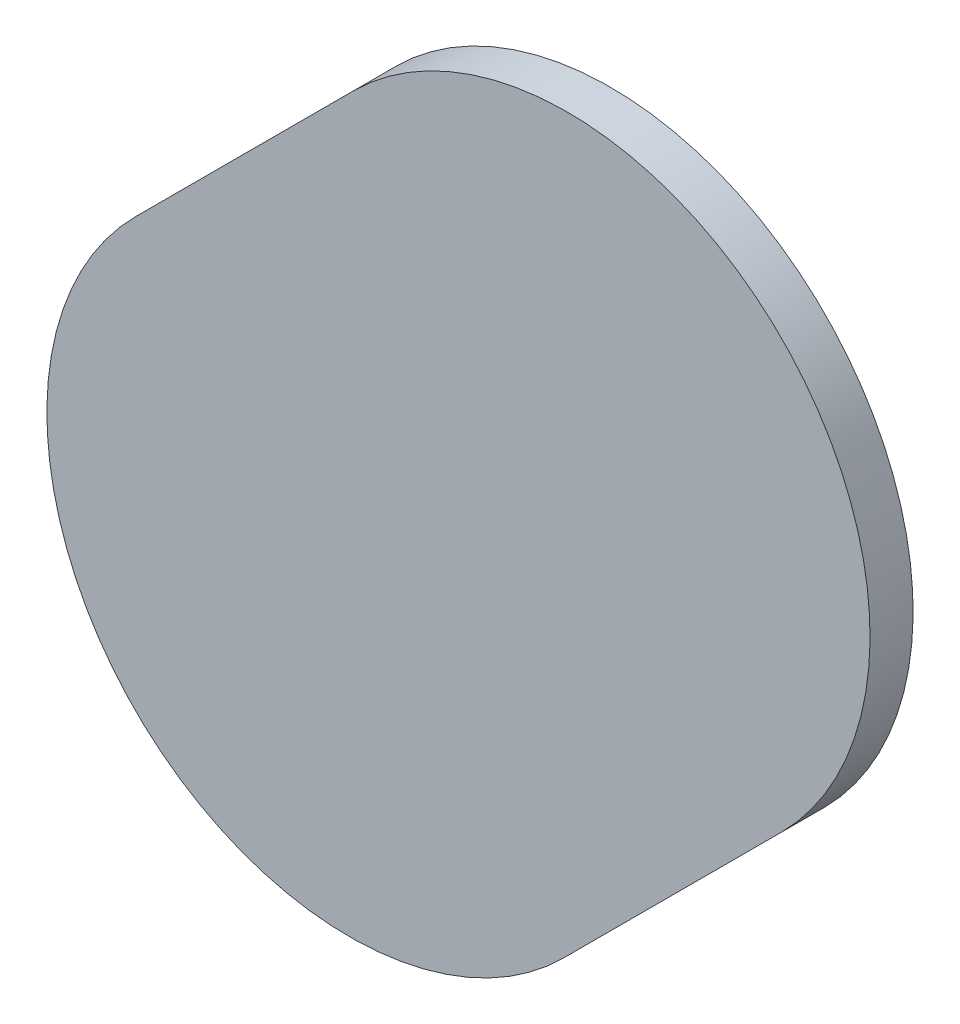
ISO-10303-21;
HEADER;
FILE_DESCRIPTION(('STEP AP214'),'2;1');
FILE_NAME('part.step','',(''),(''),'','','');
FILE_SCHEMA(('AUTOMOTIVE_DESIGN { 1 0 10303 214 1 1 1 1 }'));
ENDSEC;
DATA;
#1=APPLICATION_CONTEXT('core data for automotive mechanical design processes');
#2=APPLICATION_PROTOCOL_DEFINITION('international standard','automotive_design',2000,#1);
#3=PRODUCT_CONTEXT('',#1,'mechanical');
#4=PRODUCT('Part','Part','',(#3));
#5=PRODUCT_RELATED_PRODUCT_CATEGORY('part','',(#4));
#6=PRODUCT_DEFINITION_FORMATION('','',#4);
#7=PRODUCT_DEFINITION_CONTEXT('part definition',#1,'design');
#8=PRODUCT_DEFINITION('design','',#6,#7);
#9=PRODUCT_DEFINITION_SHAPE('','',#8);
#10=(LENGTH_UNIT() NAMED_UNIT(*) SI_UNIT(.MILLI.,.METRE.));
#11=(NAMED_UNIT(*) PLANE_ANGLE_UNIT() SI_UNIT($,.RADIAN.));
#12=(NAMED_UNIT(*) SI_UNIT($,.STERADIAN.) SOLID_ANGLE_UNIT());
#13=UNCERTAINTY_MEASURE_WITH_UNIT(LENGTH_MEASURE(1.E-05),#10,'distance_accuracy_value','');
#14=(GEOMETRIC_REPRESENTATION_CONTEXT(3) GLOBAL_UNCERTAINTY_ASSIGNED_CONTEXT((#13)) GLOBAL_UNIT_ASSIGNED_CONTEXT((#10,
#11,#12)) REPRESENTATION_CONTEXT('',''));
#15=CARTESIAN_POINT('',(0.,0.,0.));
#16=DIRECTION('',(0.,0.,1.));
#17=DIRECTION('',(1.,0.,0.));
#18=AXIS2_PLACEMENT_3D('',#15,#16,#17);
#19=CARTESIAN_POINT('',(59.95679398,59.76722362,0.));
#20=DIRECTION('',(-0.707106781186548,0.707106781186548,0.));
#21=DIRECTION('',(0.707106781186548,0.707106781186548,0.));
#22=AXIS2_PLACEMENT_3D('',#19,#20,#21);
#23=PLANE('',#22);
#24=DIRECTION('',(0.707106781186548,0.707106781186548,0.));
#25=VECTOR('',#24,1.);
#26=CARTESIAN_POINT('',(59.95679398,59.76722362,0.03556));
#27=LINE('',#26,#25);
#28=CARTESIAN_POINT('',(59.95679398,59.76722362,0.03556));
#29=VERTEX_POINT('',#28);
#30=CARTESIAN_POINT('',(60.13677838,59.94720802,0.03556));
#31=VERTEX_POINT('',#30);
#32=EDGE_CURVE('E11',#29,#31,#27,.T.);
#33=ORIENTED_EDGE('',*,*,#32,.F.);
#34=DIRECTION('',(0.,0.,1.));
#35=VECTOR('',#34,1.);
#36=CARTESIAN_POINT('',(59.95679398,59.76722362,0.));
#37=LINE('',#36,#35);
#38=CARTESIAN_POINT('',(59.95679398,59.76722362,0.));
#39=VERTEX_POINT('',#38);
#40=EDGE_CURVE('E24',#39,#29,#37,.T.);
#41=ORIENTED_EDGE('',*,*,#40,.F.);
#42=DIRECTION('',(0.707106781186548,0.707106781186548,0.));
#43=VECTOR('',#42,1.);
#44=CARTESIAN_POINT('',(59.95679398,59.76722362,0.));
#45=LINE('',#44,#43);
#46=CARTESIAN_POINT('',(60.13677838,59.94720802,0.));
#47=VERTEX_POINT('',#46);
#48=EDGE_CURVE('E75',#39,#47,#45,.T.);
#49=ORIENTED_EDGE('',*,*,#48,.T.);
#50=DIRECTION('',(0.,0.,1.));
#51=VECTOR('',#50,1.);
#52=CARTESIAN_POINT('',(60.13677838,59.94720802,0.));
#53=LINE('',#52,#51);
#54=EDGE_CURVE('E37',#47,#31,#53,.T.);
#55=ORIENTED_EDGE('',*,*,#54,.T.);
#56=EDGE_LOOP('',(#33,#41,#49,#55));
#57=FACE_BOUND('',#56,.T.);
#58=ADVANCED_FACE('F17',(#57),#23,.F.);
#59=CARTESIAN_POINT('',(59.960002,60.1239844,0.));
#60=DIRECTION('',(0.,0.,-1.));
#61=DIRECTION('',(0.707106781186548,-0.707106781186548,0.));
#62=AXIS2_PLACEMENT_3D('',#59,#60,#61);
#63=CYLINDRICAL_SURFACE('',#62,0.24999955410322);
#64=CARTESIAN_POINT('',(59.960002,60.1239844,0.03556));
#65=DIRECTION('',(0.,0.,1.));
#66=DIRECTION('',(0.707106781186548,-0.707106781186548,0.));
#67=AXIS2_PLACEMENT_3D('',#64,#65,#66);
#68=CIRCLE('',#67,0.24999955410322);
#69=CARTESIAN_POINT('',(59.78322562,60.30076078,0.03556));
#70=VERTEX_POINT('',#69);
#71=EDGE_CURVE('E83',#31,#70,#68,.T.);
#72=ORIENTED_EDGE('',*,*,#71,.F.);
#73=ORIENTED_EDGE('',*,*,#54,.F.);
#74=CARTESIAN_POINT('',(59.960002,60.1239844,0.));
#75=DIRECTION('',(0.,0.,1.));
#76=DIRECTION('',(0.707106781186548,-0.707106781186548,0.));
#77=AXIS2_PLACEMENT_3D('',#74,#75,#76);
#78=CIRCLE('',#77,0.24999955410322);
#79=CARTESIAN_POINT('',(59.78322562,60.30076078,0.));
#80=VERTEX_POINT('',#79);
#81=EDGE_CURVE('E81',#47,#80,#78,.T.);
#82=ORIENTED_EDGE('',*,*,#81,.T.);
#83=DIRECTION('',(0.,0.,1.));
#84=VECTOR('',#83,1.);
#85=CARTESIAN_POINT('',(59.78322562,60.30076078,0.));
#86=LINE('',#85,#84);
#87=EDGE_CURVE('E67',#80,#70,#86,.T.);
#88=ORIENTED_EDGE('',*,*,#87,.T.);
#89=EDGE_LOOP('',(#72,#73,#82,#88));
#90=FACE_BOUND('',#89,.T.);
#91=ADVANCED_FACE('F89',(#90),#63,.T.);
#92=CARTESIAN_POINT('',(59.78322562,60.30076078,0.));
#93=DIRECTION('',(0.707106781186562,-0.707106781186534,0.));
#94=DIRECTION('',(-0.707106781186534,-0.707106781186562,0.));
#95=AXIS2_PLACEMENT_3D('',#92,#93,#94);
#96=PLANE('',#95);
#97=DIRECTION('',(-0.707106781186534,-0.707106781186562,0.));
#98=VECTOR('',#97,1.);
#99=CARTESIAN_POINT('',(59.78322562,60.30076078,0.03556));
#100=LINE('',#99,#98);
#101=CARTESIAN_POINT('',(59.60324122,60.12077638,0.03556));
#102=VERTEX_POINT('',#101);
#103=EDGE_CURVE('E71',#70,#102,#100,.T.);
#104=ORIENTED_EDGE('',*,*,#103,.F.);
#105=ORIENTED_EDGE('',*,*,#87,.F.);
#106=DIRECTION('',(-0.707106781186534,-0.707106781186562,0.));
#107=VECTOR('',#106,1.);
#108=CARTESIAN_POINT('',(59.78322562,60.30076078,0.));
#109=LINE('',#108,#107);
#110=CARTESIAN_POINT('',(59.60324122,60.12077638,0.));
#111=VERTEX_POINT('',#110);
#112=EDGE_CURVE('E63',#80,#111,#109,.T.);
#113=ORIENTED_EDGE('',*,*,#112,.T.);
#114=DIRECTION('',(0.,0.,1.));
#115=VECTOR('',#114,1.);
#116=CARTESIAN_POINT('',(59.60324122,60.12077638,0.));
#117=LINE('',#116,#115);
#118=EDGE_CURVE('E53',#111,#102,#117,.T.);
#119=ORIENTED_EDGE('',*,*,#118,.T.);
#120=EDGE_LOOP('',(#104,#105,#113,#119));
#121=FACE_BOUND('',#120,.T.);
#122=ADVANCED_FACE('F66',(#121),#96,.F.);
#123=CARTESIAN_POINT('',(59.7800176,59.944,0.));
#124=DIRECTION('',(0.,0.,-1.));
#125=DIRECTION('',(-0.707106781186533,0.707106781186562,0.));
#126=AXIS2_PLACEMENT_3D('',#123,#124,#125);
#127=CYLINDRICAL_SURFACE('',#126,0.249999554103216);
#128=CARTESIAN_POINT('',(59.7800176,59.944,0.03556));
#129=DIRECTION('',(0.,0.,1.));
#130=DIRECTION('',(-0.707106781186533,0.707106781186562,0.));
#131=AXIS2_PLACEMENT_3D('',#128,#129,#130);
#132=CIRCLE('',#131,0.249999554103216);
#133=EDGE_CURVE('E59',#102,#29,#132,.T.);
#134=ORIENTED_EDGE('',*,*,#133,.F.);
#135=ORIENTED_EDGE('',*,*,#118,.F.);
#136=CARTESIAN_POINT('',(59.7800176,59.944,0.));
#137=DIRECTION('',(0.,0.,1.));
#138=DIRECTION('',(-0.707106781186533,0.707106781186562,0.));
#139=AXIS2_PLACEMENT_3D('',#136,#137,#138);
#140=CIRCLE('',#139,0.249999554103216);
#141=EDGE_CURVE('E57',#111,#39,#140,.T.);
#142=ORIENTED_EDGE('',*,*,#141,.T.);
#143=ORIENTED_EDGE('',*,*,#40,.T.);
#144=EDGE_LOOP('',(#134,#135,#142,#143));
#145=FACE_BOUND('',#144,.T.);
#146=ADVANCED_FACE('F55',(#145),#127,.T.);
#147=CARTESIAN_POINT('',(59.95679398,59.76722362,0.));
#148=DIRECTION('',(0.,0.,-1.));
#149=DIRECTION('',(-1.,0.,0.));
#150=AXIS2_PLACEMENT_3D('',#147,#148,#149);
#151=PLANE('',#150);
#152=ORIENTED_EDGE('',*,*,#141,.F.);
#153=ORIENTED_EDGE('',*,*,#112,.F.);
#154=ORIENTED_EDGE('',*,*,#81,.F.);
#155=ORIENTED_EDGE('',*,*,#48,.F.);
#156=EDGE_LOOP('',(#152,#153,#154,#155));
#157=FACE_BOUND('',#156,.T.);
#158=ADVANCED_FACE('F74',(#157),#151,.T.);
#159=CARTESIAN_POINT('',(59.95679398,59.76722362,0.03556));
#160=DIRECTION('',(0.,0.,-1.));
#161=DIRECTION('',(-1.,0.,0.));
#162=AXIS2_PLACEMENT_3D('',#159,#160,#161);
#163=PLANE('',#162);
#164=ORIENTED_EDGE('',*,*,#32,.T.);
#165=ORIENTED_EDGE('',*,*,#71,.T.);
#166=ORIENTED_EDGE('',*,*,#103,.T.);
#167=ORIENTED_EDGE('',*,*,#133,.T.);
#168=EDGE_LOOP('',(#164,#165,#166,#167));
#169=FACE_BOUND('',#168,.T.);
#170=ADVANCED_FACE('F91',(#169),#163,.F.);
#171=CLOSED_SHELL('',(#58,#91,#122,#146,#158,#170));
#172=MANIFOLD_SOLID_BREP('B1',#171);
#173=ADVANCED_BREP_SHAPE_REPRESENTATION('',(#18,#172),#14);
#174=SHAPE_DEFINITION_REPRESENTATION(#9,#173);
ENDSEC;
END-ISO-10303-21;
